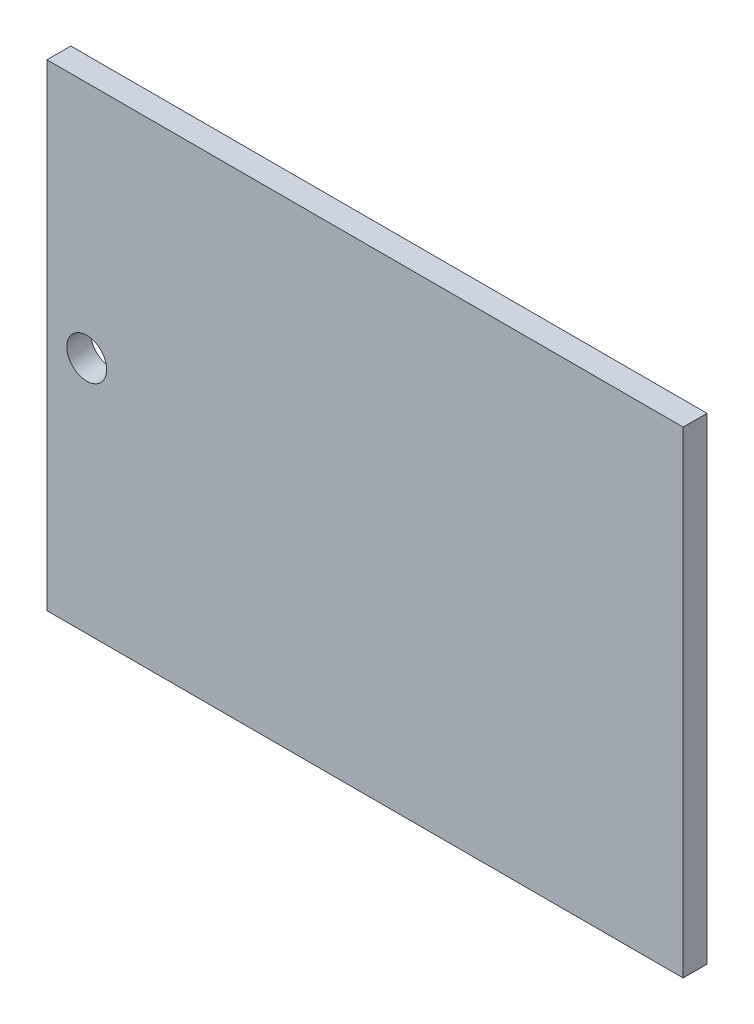
ISO-10303-21;
HEADER;
FILE_DESCRIPTION(('STEP AP214'),'2;1');
FILE_NAME('part.step','',(''),(''),'','','');
FILE_SCHEMA(('AUTOMOTIVE_DESIGN { 1 0 10303 214 1 1 1 1 }'));
ENDSEC;
DATA;
#1=APPLICATION_CONTEXT('core data for automotive mechanical design processes');
#2=APPLICATION_PROTOCOL_DEFINITION('international standard','automotive_design',2000,#1);
#3=PRODUCT_CONTEXT('',#1,'mechanical');
#4=PRODUCT('Part','Part','',(#3));
#5=PRODUCT_RELATED_PRODUCT_CATEGORY('part','',(#4));
#6=PRODUCT_DEFINITION_FORMATION('','',#4);
#7=PRODUCT_DEFINITION_CONTEXT('part definition',#1,'design');
#8=PRODUCT_DEFINITION('design','',#6,#7);
#9=PRODUCT_DEFINITION_SHAPE('','',#8);
#10=(LENGTH_UNIT() NAMED_UNIT(*) SI_UNIT(.MILLI.,.METRE.));
#11=(NAMED_UNIT(*) PLANE_ANGLE_UNIT() SI_UNIT($,.RADIAN.));
#12=(NAMED_UNIT(*) SI_UNIT($,.STERADIAN.) SOLID_ANGLE_UNIT());
#13=UNCERTAINTY_MEASURE_WITH_UNIT(LENGTH_MEASURE(1.E-05),#10,'distance_accuracy_value','');
#14=(GEOMETRIC_REPRESENTATION_CONTEXT(3) GLOBAL_UNCERTAINTY_ASSIGNED_CONTEXT((#13)) GLOBAL_UNIT_ASSIGNED_CONTEXT((#10,
#11,#12)) REPRESENTATION_CONTEXT('',''));
#15=CARTESIAN_POINT('',(0.,0.,0.));
#16=DIRECTION('',(0.,0.,1.));
#17=DIRECTION('',(1.,0.,0.));
#18=AXIS2_PLACEMENT_3D('',#15,#16,#17);
#19=CARTESIAN_POINT('',(20.,-15.,1.5));
#20=DIRECTION('',(-1.,0.,0.));
#21=DIRECTION('',(0.,0.,1.));
#22=AXIS2_PLACEMENT_3D('',#19,#20,#21);
#23=PLANE('',#22);
#24=DIRECTION('',(0.,1.,0.));
#25=VECTOR('',#24,1.);
#26=CARTESIAN_POINT('',(20.,-15.,0.));
#27=LINE('',#26,#25);
#28=CARTESIAN_POINT('',(20.,-15.,0.));
#29=VERTEX_POINT('',#28);
#30=CARTESIAN_POINT('',(20.,15.,0.));
#31=VERTEX_POINT('',#30);
#32=EDGE_CURVE('E105',#29,#31,#27,.T.);
#33=ORIENTED_EDGE('',*,*,#32,.T.);
#34=DIRECTION('',(0.,0.,-1.));
#35=VECTOR('',#34,1.);
#36=CARTESIAN_POINT('',(20.,15.,1.5));
#37=LINE('',#36,#35);
#38=CARTESIAN_POINT('',(20.,15.,1.5));
#39=VERTEX_POINT('',#38);
#40=EDGE_CURVE('E11',#39,#31,#37,.T.);
#41=ORIENTED_EDGE('',*,*,#40,.F.);
#42=DIRECTION('',(0.,1.,0.));
#43=VECTOR('',#42,1.);
#44=CARTESIAN_POINT('',(20.,-15.,1.5));
#45=LINE('',#44,#43);
#46=CARTESIAN_POINT('',(20.,-15.,1.5));
#47=VERTEX_POINT('',#46);
#48=EDGE_CURVE('E89',#47,#39,#45,.T.);
#49=ORIENTED_EDGE('',*,*,#48,.F.);
#50=DIRECTION('',(0.,0.,-1.));
#51=VECTOR('',#50,1.);
#52=CARTESIAN_POINT('',(20.,-15.,1.5));
#53=LINE('',#52,#51);
#54=EDGE_CURVE('E98',#47,#29,#53,.T.);
#55=ORIENTED_EDGE('',*,*,#54,.T.);
#56=EDGE_LOOP('',(#33,#41,#49,#55));
#57=FACE_BOUND('',#56,.T.);
#58=ADVANCED_FACE('F39',(#57),#23,.F.);
#59=CARTESIAN_POINT('',(-20.,15.,1.5));
#60=DIRECTION('',(0.,-1.,0.));
#61=DIRECTION('',(0.,0.,-1.));
#62=AXIS2_PLACEMENT_3D('',#59,#60,#61);
#63=PLANE('',#62);
#64=DIRECTION('',(-1.,0.,0.));
#65=VECTOR('',#64,1.);
#66=CARTESIAN_POINT('',(-20.,15.,0.));
#67=LINE('',#66,#65);
#68=CARTESIAN_POINT('',(-20.,15.,0.));
#69=VERTEX_POINT('',#68);
#70=EDGE_CURVE('E94',#31,#69,#67,.T.);
#71=ORIENTED_EDGE('',*,*,#70,.T.);
#72=DIRECTION('',(0.,0.,-1.));
#73=VECTOR('',#72,1.);
#74=CARTESIAN_POINT('',(-20.,15.,1.5));
#75=LINE('',#74,#73);
#76=CARTESIAN_POINT('',(-20.,15.,1.5));
#77=VERTEX_POINT('',#76);
#78=EDGE_CURVE('E50',#77,#69,#75,.T.);
#79=ORIENTED_EDGE('',*,*,#78,.F.);
#80=DIRECTION('',(-1.,0.,0.));
#81=VECTOR('',#80,1.);
#82=CARTESIAN_POINT('',(-20.,15.,1.5));
#83=LINE('',#82,#81);
#84=EDGE_CURVE('E84',#39,#77,#83,.T.);
#85=ORIENTED_EDGE('',*,*,#84,.F.);
#86=ORIENTED_EDGE('',*,*,#40,.T.);
#87=EDGE_LOOP('',(#71,#79,#85,#86));
#88=FACE_BOUND('',#87,.T.);
#89=ADVANCED_FACE('F91',(#88),#63,.F.);
#90=CARTESIAN_POINT('',(-20.,-15.,1.5));
#91=DIRECTION('',(1.,0.,0.));
#92=DIRECTION('',(0.,0.,-1.));
#93=AXIS2_PLACEMENT_3D('',#90,#91,#92);
#94=PLANE('',#93);
#95=DIRECTION('',(0.,-1.,0.));
#96=VECTOR('',#95,1.);
#97=CARTESIAN_POINT('',(-20.,-15.,0.));
#98=LINE('',#97,#96);
#99=CARTESIAN_POINT('',(-20.,-15.,0.));
#100=VERTEX_POINT('',#99);
#101=EDGE_CURVE('E75',#69,#100,#98,.T.);
#102=ORIENTED_EDGE('',*,*,#101,.T.);
#103=DIRECTION('',(0.,0.,-1.));
#104=VECTOR('',#103,1.);
#105=CARTESIAN_POINT('',(-20.,-15.,1.5));
#106=LINE('',#105,#104);
#107=CARTESIAN_POINT('',(-20.,-15.,1.5));
#108=VERTEX_POINT('',#107);
#109=EDGE_CURVE('E92',#108,#100,#106,.T.);
#110=ORIENTED_EDGE('',*,*,#109,.F.);
#111=DIRECTION('',(0.,-1.,0.));
#112=VECTOR('',#111,1.);
#113=CARTESIAN_POINT('',(-20.,-15.,1.5));
#114=LINE('',#113,#112);
#115=EDGE_CURVE('E86',#77,#108,#114,.T.);
#116=ORIENTED_EDGE('',*,*,#115,.F.);
#117=ORIENTED_EDGE('',*,*,#78,.T.);
#118=EDGE_LOOP('',(#102,#110,#116,#117));
#119=FACE_BOUND('',#118,.T.);
#120=ADVANCED_FACE('F96',(#119),#94,.F.);
#121=CARTESIAN_POINT('',(-20.,-15.,1.5));
#122=DIRECTION('',(0.,1.,0.));
#123=DIRECTION('',(0.,0.,1.));
#124=AXIS2_PLACEMENT_3D('',#121,#122,#123);
#125=PLANE('',#124);
#126=DIRECTION('',(1.,0.,0.));
#127=VECTOR('',#126,1.);
#128=CARTESIAN_POINT('',(-20.,-15.,0.));
#129=LINE('',#128,#127);
#130=EDGE_CURVE('E79',#100,#29,#129,.T.);
#131=ORIENTED_EDGE('',*,*,#130,.T.);
#132=ORIENTED_EDGE('',*,*,#54,.F.);
#133=DIRECTION('',(1.,0.,0.));
#134=VECTOR('',#133,1.);
#135=CARTESIAN_POINT('',(-20.,-15.,1.5));
#136=LINE('',#135,#134);
#137=EDGE_CURVE('E54',#108,#47,#136,.T.);
#138=ORIENTED_EDGE('',*,*,#137,.F.);
#139=ORIENTED_EDGE('',*,*,#109,.T.);
#140=EDGE_LOOP('',(#131,#132,#138,#139));
#141=FACE_BOUND('',#140,.T.);
#142=ADVANCED_FACE('F109',(#141),#125,.F.);
#143=CARTESIAN_POINT('',(0.,0.,1.5));
#144=DIRECTION('',(0.,0.,-1.));
#145=DIRECTION('',(-1.,0.,0.));
#146=AXIS2_PLACEMENT_3D('',#143,#144,#145);
#147=PLANE('',#146);
#148=CARTESIAN_POINT('',(-17.5,0.,1.5));
#149=DIRECTION('',(0.,0.,1.));
#150=DIRECTION('',(1.,0.,0.));
#151=AXIS2_PLACEMENT_3D('',#148,#149,#150);
#152=CIRCLE('',#151,1.25);
#153=CARTESIAN_POINT('',(-16.25,0.,1.5));
#154=VERTEX_POINT('',#153);
#155=EDGE_CURVE('E117',#154,#154,#152,.T.);
#156=ORIENTED_EDGE('',*,*,#155,.F.);
#157=EDGE_LOOP('',(#156));
#158=FACE_BOUND('',#157,.T.);
#159=ORIENTED_EDGE('',*,*,#48,.T.);
#160=ORIENTED_EDGE('',*,*,#84,.T.);
#161=ORIENTED_EDGE('',*,*,#115,.T.);
#162=ORIENTED_EDGE('',*,*,#137,.T.);
#163=EDGE_LOOP('',(#159,#160,#161,#162));
#164=FACE_BOUND('',#163,.T.);
#165=ADVANCED_FACE('F88',(#158,#164),#147,.F.);
#166=CARTESIAN_POINT('',(0.,0.,0.));
#167=DIRECTION('',(0.,0.,-1.));
#168=DIRECTION('',(-1.,0.,0.));
#169=AXIS2_PLACEMENT_3D('',#166,#167,#168);
#170=PLANE('',#169);
#171=CARTESIAN_POINT('',(-17.5,0.,0.));
#172=DIRECTION('',(0.,0.,1.));
#173=DIRECTION('',(1.,0.,0.));
#174=AXIS2_PLACEMENT_3D('',#171,#172,#173);
#175=CIRCLE('',#174,1.25);
#176=CARTESIAN_POINT('',(-16.25,0.,0.));
#177=VERTEX_POINT('',#176);
#178=EDGE_CURVE('E104',#177,#177,#175,.T.);
#179=ORIENTED_EDGE('',*,*,#178,.T.);
#180=EDGE_LOOP('',(#179));
#181=FACE_BOUND('',#180,.T.);
#182=ORIENTED_EDGE('',*,*,#32,.F.);
#183=ORIENTED_EDGE('',*,*,#130,.F.);
#184=ORIENTED_EDGE('',*,*,#101,.F.);
#185=ORIENTED_EDGE('',*,*,#70,.F.);
#186=EDGE_LOOP('',(#182,#183,#184,#185));
#187=FACE_BOUND('',#186,.T.);
#188=ADVANCED_FACE('F114',(#181,#187),#170,.T.);
#189=CARTESIAN_POINT('',(-17.5,0.,0.));
#190=DIRECTION('',(0.,0.,1.));
#191=DIRECTION('',(1.,0.,0.));
#192=AXIS2_PLACEMENT_3D('',#189,#190,#191);
#193=CYLINDRICAL_SURFACE('',#192,1.25);
#194=ORIENTED_EDGE('',*,*,#178,.F.);
#195=EDGE_LOOP('',(#194));
#196=FACE_BOUND('',#195,.T.);
#197=ORIENTED_EDGE('',*,*,#155,.T.);
#198=EDGE_LOOP('',(#197));
#199=FACE_BOUND('',#198,.T.);
#200=ADVANCED_FACE('F123',(#196,#199),#193,.F.);
#201=CLOSED_SHELL('',(#58,#89,#120,#142,#165,#188,#200));
#202=MANIFOLD_SOLID_BREP('B2',#201);
#203=ADVANCED_BREP_SHAPE_REPRESENTATION('',(#18,#202),#14);
#204=SHAPE_DEFINITION_REPRESENTATION(#9,#203);
ENDSEC;
END-ISO-10303-21;
